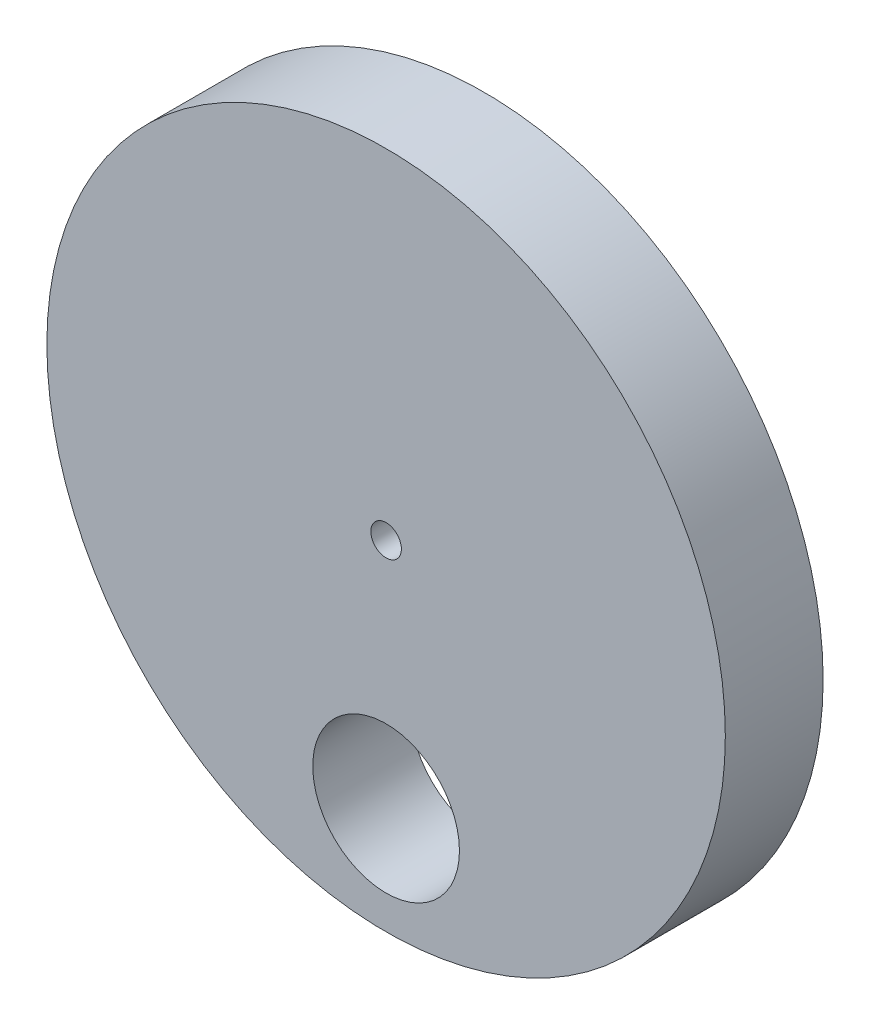
ISO-10303-21;
HEADER;
FILE_DESCRIPTION(('STEP AP214'),'2;1');
FILE_NAME('part.step','',(''),(''),'','','');
FILE_SCHEMA(('AUTOMOTIVE_DESIGN { 1 0 10303 214 1 1 1 1 }'));
ENDSEC;
DATA;
#1=APPLICATION_CONTEXT('core data for automotive mechanical design processes');
#2=APPLICATION_PROTOCOL_DEFINITION('international standard','automotive_design',2000,#1);
#3=PRODUCT_CONTEXT('',#1,'mechanical');
#4=PRODUCT('Part','Part','',(#3));
#5=PRODUCT_RELATED_PRODUCT_CATEGORY('part','',(#4));
#6=PRODUCT_DEFINITION_FORMATION('','',#4);
#7=PRODUCT_DEFINITION_CONTEXT('part definition',#1,'design');
#8=PRODUCT_DEFINITION('design','',#6,#7);
#9=PRODUCT_DEFINITION_SHAPE('','',#8);
#10=(LENGTH_UNIT() NAMED_UNIT(*) SI_UNIT(.MILLI.,.METRE.));
#11=(NAMED_UNIT(*) PLANE_ANGLE_UNIT() SI_UNIT($,.RADIAN.));
#12=(NAMED_UNIT(*) SI_UNIT($,.STERADIAN.) SOLID_ANGLE_UNIT());
#13=UNCERTAINTY_MEASURE_WITH_UNIT(LENGTH_MEASURE(1.E-05),#10,'distance_accuracy_value','');
#14=(GEOMETRIC_REPRESENTATION_CONTEXT(3) GLOBAL_UNCERTAINTY_ASSIGNED_CONTEXT((#13)) GLOBAL_UNIT_ASSIGNED_CONTEXT((#10,
#11,#12)) REPRESENTATION_CONTEXT('',''));
#15=CARTESIAN_POINT('',(0.,0.,0.));
#16=DIRECTION('',(0.,0.,1.));
#17=DIRECTION('',(1.,0.,0.));
#18=AXIS2_PLACEMENT_3D('',#15,#16,#17);
#19=CARTESIAN_POINT('',(0.,0.,0.));
#20=DIRECTION('',(0.,0.,1.));
#21=DIRECTION('',(1.,0.,0.));
#22=AXIS2_PLACEMENT_3D('',#19,#20,#21);
#23=PLANE('',#22);
#24=CARTESIAN_POINT('',(0.,0.,0.));
#25=DIRECTION('',(0.,0.,1.));
#26=DIRECTION('',(1.,0.,0.));
#27=AXIS2_PLACEMENT_3D('',#24,#25,#26);
#28=CIRCLE('',#27,2.5);
#29=CARTESIAN_POINT('',(2.5,0.,0.));
#30=VERTEX_POINT('',#29);
#31=EDGE_CURVE('E91',#30,#30,#28,.T.);
#32=ORIENTED_EDGE('',*,*,#31,.T.);
#33=EDGE_LOOP('',(#32));
#34=FACE_BOUND('',#33,.T.);
#35=CARTESIAN_POINT('',(0.,0.,0.));
#36=DIRECTION('',(0.,0.,1.));
#37=DIRECTION('',(1.,0.,0.));
#38=AXIS2_PLACEMENT_3D('',#35,#36,#37);
#39=CIRCLE('',#38,5.6);
#40=CARTESIAN_POINT('',(5.6,0.,0.));
#41=VERTEX_POINT('',#40);
#42=EDGE_CURVE('E78',#41,#41,#39,.T.);
#43=ORIENTED_EDGE('',*,*,#42,.F.);
#44=EDGE_LOOP('',(#43));
#45=FACE_BOUND('',#44,.T.);
#46=ADVANCED_FACE('F39',(#34,#45),#23,.F.);
#47=CARTESIAN_POINT('',(0.,0.,0.));
#48=DIRECTION('',(0.,0.,1.));
#49=DIRECTION('',(1.,0.,0.));
#50=AXIS2_PLACEMENT_3D('',#47,#48,#49);
#51=CIRCLE('',#50,55.5);
#52=CARTESIAN_POINT('',(55.5,0.,0.));
#53=VERTEX_POINT('',#52);
#54=EDGE_CURVE('E43',#53,#53,#51,.T.);
#55=ORIENTED_EDGE('',*,*,#54,.F.);
#56=EDGE_LOOP('',(#55));
#57=FACE_BOUND('',#56,.T.);
#58=CARTESIAN_POINT('',(0.,-38.,0.));
#59=DIRECTION('',(0.,0.,1.));
#60=DIRECTION('',(1.,0.,0.));
#61=AXIS2_PLACEMENT_3D('',#58,#59,#60);
#62=CIRCLE('',#61,12.);
#63=CARTESIAN_POINT('',(12.,-38.,0.));
#64=VERTEX_POINT('',#63);
#65=EDGE_CURVE('E97',#64,#64,#62,.T.);
#66=ORIENTED_EDGE('',*,*,#65,.T.);
#67=EDGE_LOOP('',(#66));
#68=FACE_BOUND('',#67,.T.);
#69=CARTESIAN_POINT('',(0.,-38.,0.));
#70=DIRECTION('',(0.,0.,1.));
#71=DIRECTION('',(1.,0.,0.));
#72=AXIS2_PLACEMENT_3D('',#69,#70,#71);
#73=CIRCLE('',#72,15.1);
#74=CARTESIAN_POINT('',(5.32929981777943,-52.1282894736842,0.));
#75=VERTEX_POINT('',#74);
#76=CARTESIAN_POINT('',(-5.32929981777943,-52.1282894736842,0.));
#77=VERTEX_POINT('',#76);
#78=EDGE_CURVE('E54',#75,#77,#73,.T.);
#79=ORIENTED_EDGE('',*,*,#78,.F.);
#80=CARTESIAN_POINT('',(0.,0.,0.));
#81=DIRECTION('',(0.,0.,1.));
#82=DIRECTION('',(1.,0.,0.));
#83=AXIS2_PLACEMENT_3D('',#80,#81,#82);
#84=CIRCLE('',#83,52.4);
#85=EDGE_CURVE('E70',#75,#77,#84,.T.);
#86=ORIENTED_EDGE('',*,*,#85,.T.);
#87=EDGE_LOOP('',(#79,#86));
#88=FACE_BOUND('',#87,.T.);
#89=ADVANCED_FACE('F114',(#57,#68,#88),#23,.F.);
#90=CARTESIAN_POINT('',(0.,0.,16.));
#91=DIRECTION('',(0.,0.,-1.));
#92=DIRECTION('',(-1.,0.,0.));
#93=AXIS2_PLACEMENT_3D('',#90,#91,#92);
#94=CYLINDRICAL_SURFACE('',#93,55.5);
#95=CARTESIAN_POINT('',(0.,0.,16.));
#96=DIRECTION('',(0.,0.,1.));
#97=DIRECTION('',(1.,0.,0.));
#98=AXIS2_PLACEMENT_3D('',#95,#96,#97);
#99=CIRCLE('',#98,55.5);
#100=CARTESIAN_POINT('',(55.5,0.,16.));
#101=VERTEX_POINT('',#100);
#102=EDGE_CURVE('E11',#101,#101,#99,.T.);
#103=ORIENTED_EDGE('',*,*,#102,.F.);
#104=EDGE_LOOP('',(#103));
#105=FACE_BOUND('',#104,.T.);
#106=ORIENTED_EDGE('',*,*,#54,.T.);
#107=EDGE_LOOP('',(#106));
#108=FACE_BOUND('',#107,.T.);
#109=ADVANCED_FACE('F41',(#105,#108),#94,.T.);
#110=CARTESIAN_POINT('',(0.,0.,16.));
#111=DIRECTION('',(0.,0.,1.));
#112=DIRECTION('',(1.,0.,0.));
#113=AXIS2_PLACEMENT_3D('',#110,#111,#112);
#114=PLANE('',#113);
#115=CARTESIAN_POINT('',(0.,0.,16.));
#116=DIRECTION('',(0.,0.,1.));
#117=DIRECTION('',(1.,0.,0.));
#118=AXIS2_PLACEMENT_3D('',#115,#116,#117);
#119=CIRCLE('',#118,2.5);
#120=CARTESIAN_POINT('',(2.5,0.,16.));
#121=VERTEX_POINT('',#120);
#122=EDGE_CURVE('E71',#121,#121,#119,.T.);
#123=ORIENTED_EDGE('',*,*,#122,.F.);
#124=EDGE_LOOP('',(#123));
#125=FACE_BOUND('',#124,.T.);
#126=CARTESIAN_POINT('',(0.,-38.,16.));
#127=DIRECTION('',(0.,0.,1.));
#128=DIRECTION('',(1.,0.,0.));
#129=AXIS2_PLACEMENT_3D('',#126,#127,#128);
#130=CIRCLE('',#129,12.);
#131=CARTESIAN_POINT('',(12.,-38.,16.));
#132=VERTEX_POINT('',#131);
#133=EDGE_CURVE('E94',#132,#132,#130,.T.);
#134=ORIENTED_EDGE('',*,*,#133,.F.);
#135=EDGE_LOOP('',(#134));
#136=FACE_BOUND('',#135,.T.);
#137=ORIENTED_EDGE('',*,*,#102,.T.);
#138=EDGE_LOOP('',(#137));
#139=FACE_BOUND('',#138,.T.);
#140=ADVANCED_FACE('F105',(#125,#136,#139),#114,.T.);
#141=CARTESIAN_POINT('',(0.,-38.,0.));
#142=DIRECTION('',(0.,0.,1.));
#143=DIRECTION('',(1.,0.,0.));
#144=AXIS2_PLACEMENT_3D('',#141,#142,#143);
#145=CYLINDRICAL_SURFACE('',#144,12.);
#146=ORIENTED_EDGE('',*,*,#65,.F.);
#147=EDGE_LOOP('',(#146));
#148=FACE_BOUND('',#147,.T.);
#149=ORIENTED_EDGE('',*,*,#133,.T.);
#150=EDGE_LOOP('',(#149));
#151=FACE_BOUND('',#150,.T.);
#152=ADVANCED_FACE('F103',(#148,#151),#145,.F.);
#153=CARTESIAN_POINT('',(0.,0.,0.));
#154=DIRECTION('',(0.,0.,1.));
#155=DIRECTION('',(1.,0.,0.));
#156=AXIS2_PLACEMENT_3D('',#153,#154,#155);
#157=CYLINDRICAL_SURFACE('',#156,2.5);
#158=ORIENTED_EDGE('',*,*,#31,.F.);
#159=EDGE_LOOP('',(#158));
#160=FACE_BOUND('',#159,.T.);
#161=ORIENTED_EDGE('',*,*,#122,.T.);
#162=EDGE_LOOP('',(#161));
#163=FACE_BOUND('',#162,.T.);
#164=ADVANCED_FACE('F124',(#160,#163),#157,.F.);
#165=CARTESIAN_POINT('',(0.,0.,16.));
#166=DIRECTION('',(0.,0.,-1.));
#167=DIRECTION('',(-1.,0.,0.));
#168=AXIS2_PLACEMENT_3D('',#165,#166,#167);
#169=CYLINDRICAL_SURFACE('',#168,52.4);
#170=DIRECTION('',(0.,0.,-1.));
#171=VECTOR('',#170,1.);
#172=CARTESIAN_POINT('',(5.32929981777943,-52.1282894736842,16.));
#173=LINE('',#172,#171);
#174=CARTESIAN_POINT('',(5.32929981777943,-52.1282894736842,12.9));
#175=VERTEX_POINT('',#174);
#176=EDGE_CURVE('E59',#75,#175,#173,.F.);
#177=ORIENTED_EDGE('',*,*,#176,.T.);
#178=CARTESIAN_POINT('',(0.,0.,12.9));
#179=DIRECTION('',(0.,0.,1.));
#180=DIRECTION('',(1.,0.,0.));
#181=AXIS2_PLACEMENT_3D('',#178,#179,#180);
#182=CIRCLE('',#181,52.4);
#183=CARTESIAN_POINT('',(-5.32929981777943,-52.1282894736842,12.9));
#184=VERTEX_POINT('',#183);
#185=EDGE_CURVE('E68',#175,#184,#182,.T.);
#186=ORIENTED_EDGE('',*,*,#185,.T.);
#187=DIRECTION('',(0.,0.,-1.));
#188=VECTOR('',#187,1.);
#189=CARTESIAN_POINT('',(-5.32929981777944,-52.1282894736842,0.));
#190=LINE('',#189,#188);
#191=EDGE_CURVE('E72',#77,#184,#190,.F.);
#192=ORIENTED_EDGE('',*,*,#191,.F.);
#193=ORIENTED_EDGE('',*,*,#85,.F.);
#194=EDGE_LOOP('',(#177,#186,#192,#193));
#195=FACE_BOUND('',#194,.T.);
#196=ADVANCED_FACE('F66',(#195),#169,.F.);
#197=CARTESIAN_POINT('',(0.,0.,12.9));
#198=DIRECTION('',(0.,0.,1.));
#199=DIRECTION('',(1.,0.,0.));
#200=AXIS2_PLACEMENT_3D('',#197,#198,#199);
#201=PLANE('',#200);
#202=CARTESIAN_POINT('',(0.,0.,12.9));
#203=DIRECTION('',(0.,0.,1.));
#204=DIRECTION('',(1.,0.,0.));
#205=AXIS2_PLACEMENT_3D('',#202,#203,#204);
#206=CIRCLE('',#205,5.6);
#207=CARTESIAN_POINT('',(5.6,0.,12.9));
#208=VERTEX_POINT('',#207);
#209=EDGE_CURVE('E85',#208,#208,#206,.T.);
#210=ORIENTED_EDGE('',*,*,#209,.T.);
#211=EDGE_LOOP('',(#210));
#212=FACE_BOUND('',#211,.T.);
#213=ORIENTED_EDGE('',*,*,#185,.F.);
#214=CARTESIAN_POINT('',(0.,-38.,12.9));
#215=DIRECTION('',(0.,0.,1.));
#216=DIRECTION('',(1.,0.,0.));
#217=AXIS2_PLACEMENT_3D('',#214,#215,#216);
#218=CIRCLE('',#217,15.1);
#219=EDGE_CURVE('E75',#175,#184,#218,.T.);
#220=ORIENTED_EDGE('',*,*,#219,.T.);
#221=EDGE_LOOP('',(#213,#220));
#222=FACE_BOUND('',#221,.T.);
#223=ADVANCED_FACE('F80',(#212,#222),#201,.F.);
#224=CARTESIAN_POINT('',(0.,-38.,0.));
#225=DIRECTION('',(0.,0.,1.));
#226=DIRECTION('',(1.,0.,0.));
#227=AXIS2_PLACEMENT_3D('',#224,#225,#226);
#228=CYLINDRICAL_SURFACE('',#227,15.1);
#229=ORIENTED_EDGE('',*,*,#78,.T.);
#230=ORIENTED_EDGE('',*,*,#191,.T.);
#231=ORIENTED_EDGE('',*,*,#219,.F.);
#232=ORIENTED_EDGE('',*,*,#176,.F.);
#233=EDGE_LOOP('',(#229,#230,#231,#232));
#234=FACE_BOUND('',#233,.T.);
#235=ADVANCED_FACE('F76',(#234),#228,.T.);
#236=CARTESIAN_POINT('',(0.,0.,0.));
#237=DIRECTION('',(0.,0.,1.));
#238=DIRECTION('',(1.,0.,0.));
#239=AXIS2_PLACEMENT_3D('',#236,#237,#238);
#240=CYLINDRICAL_SURFACE('',#239,5.6);
#241=ORIENTED_EDGE('',*,*,#42,.T.);
#242=EDGE_LOOP('',(#241));
#243=FACE_BOUND('',#242,.T.);
#244=ORIENTED_EDGE('',*,*,#209,.F.);
#245=EDGE_LOOP('',(#244));
#246=FACE_BOUND('',#245,.T.);
#247=ADVANCED_FACE('F139',(#243,#246),#240,.T.);
#248=CLOSED_SHELL('',(#46,#89,#109,#140,#152,#164,#196,#223,#235,#247));
#249=MANIFOLD_SOLID_BREP('B2',#248);
#250=ADVANCED_BREP_SHAPE_REPRESENTATION('',(#18,#249),#14);
#251=SHAPE_DEFINITION_REPRESENTATION(#9,#250);
ENDSEC;
END-ISO-10303-21;
